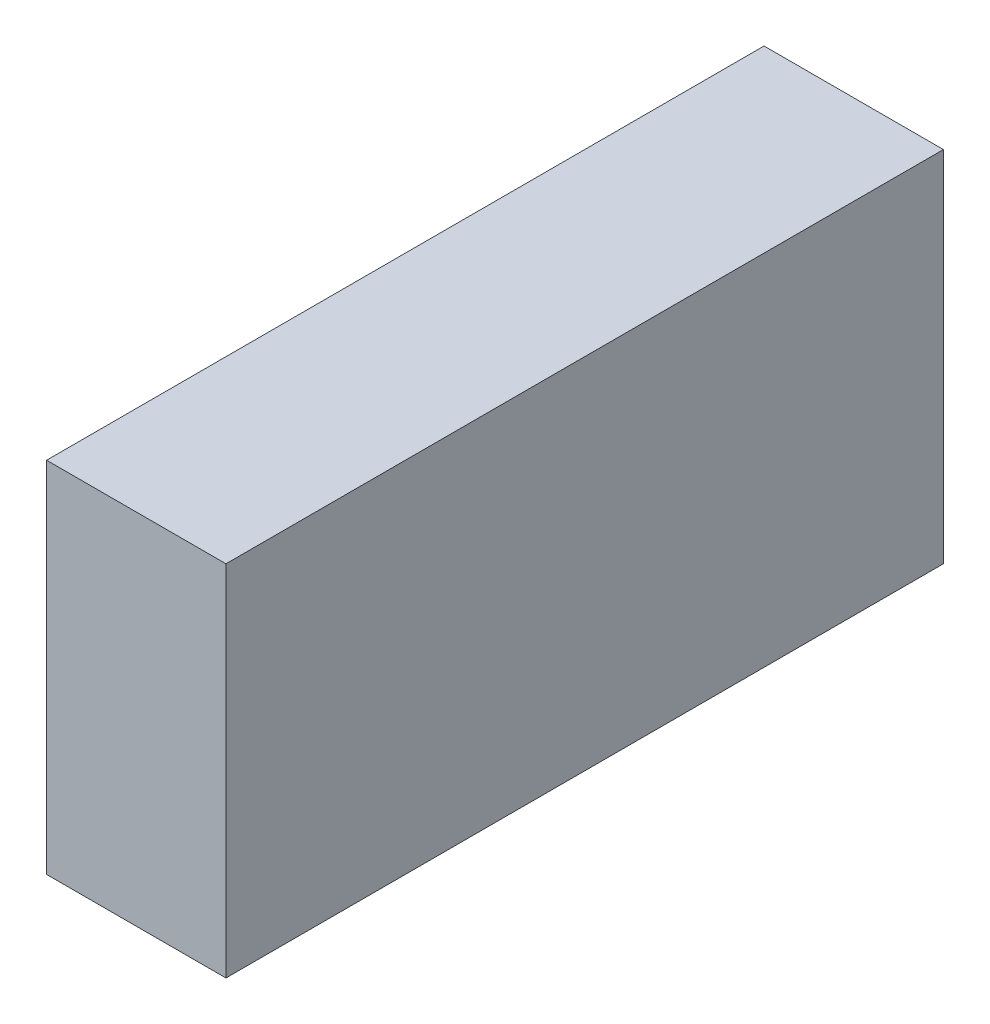
ISO-10303-21;
HEADER;
FILE_DESCRIPTION(('STEP AP214'),'2;1');
FILE_NAME('part.step','',(''),(''),'','','');
FILE_SCHEMA(('AUTOMOTIVE_DESIGN { 1 0 10303 214 1 1 1 1 }'));
ENDSEC;
DATA;
#1=APPLICATION_CONTEXT('core data for automotive mechanical design processes');
#2=APPLICATION_PROTOCOL_DEFINITION('international standard','automotive_design',2000,#1);
#3=PRODUCT_CONTEXT('',#1,'mechanical');
#4=PRODUCT('Part','Part','',(#3));
#5=PRODUCT_RELATED_PRODUCT_CATEGORY('part','',(#4));
#6=PRODUCT_DEFINITION_FORMATION('','',#4);
#7=PRODUCT_DEFINITION_CONTEXT('part definition',#1,'design');
#8=PRODUCT_DEFINITION('design','',#6,#7);
#9=PRODUCT_DEFINITION_SHAPE('','',#8);
#10=(LENGTH_UNIT() NAMED_UNIT(*) SI_UNIT(.MILLI.,.METRE.));
#11=(NAMED_UNIT(*) PLANE_ANGLE_UNIT() SI_UNIT($,.RADIAN.));
#12=(NAMED_UNIT(*) SI_UNIT($,.STERADIAN.) SOLID_ANGLE_UNIT());
#13=UNCERTAINTY_MEASURE_WITH_UNIT(LENGTH_MEASURE(1.E-05),#10,'distance_accuracy_value','');
#14=(GEOMETRIC_REPRESENTATION_CONTEXT(3) GLOBAL_UNCERTAINTY_ASSIGNED_CONTEXT((#13)) GLOBAL_UNIT_ASSIGNED_CONTEXT((#10,
#11,#12)) REPRESENTATION_CONTEXT('',''));
#15=CARTESIAN_POINT('',(0.,0.,0.));
#16=DIRECTION('',(0.,0.,1.));
#17=DIRECTION('',(1.,0.,0.));
#18=AXIS2_PLACEMENT_3D('',#15,#16,#17);
#19=CARTESIAN_POINT('',(0.,0.,40.));
#20=DIRECTION('',(1.,0.,0.));
#21=DIRECTION('',(0.,0.,-1.));
#22=AXIS2_PLACEMENT_3D('',#19,#20,#21);
#23=PLANE('',#22);
#24=DIRECTION('',(0.,-1.,0.));
#25=VECTOR('',#24,1.);
#26=CARTESIAN_POINT('',(0.,0.,0.));
#27=LINE('',#26,#25);
#28=CARTESIAN_POINT('',(0.,20.,0.));
#29=VERTEX_POINT('',#28);
#30=CARTESIAN_POINT('',(0.,0.,0.));
#31=VERTEX_POINT('',#30);
#32=EDGE_CURVE('E75',#29,#31,#27,.T.);
#33=ORIENTED_EDGE('',*,*,#32,.T.);
#34=DIRECTION('',(0.,0.,-1.));
#35=VECTOR('',#34,1.);
#36=CARTESIAN_POINT('',(0.,0.,40.));
#37=LINE('',#36,#35);
#38=CARTESIAN_POINT('',(0.,0.,40.));
#39=VERTEX_POINT('',#38);
#40=EDGE_CURVE('E11',#39,#31,#37,.T.);
#41=ORIENTED_EDGE('',*,*,#40,.F.);
#42=DIRECTION('',(0.,-1.,0.));
#43=VECTOR('',#42,1.);
#44=CARTESIAN_POINT('',(0.,0.,40.));
#45=LINE('',#44,#43);
#46=CARTESIAN_POINT('',(0.,20.,40.));
#47=VERTEX_POINT('',#46);
#48=EDGE_CURVE('E93',#47,#39,#45,.T.);
#49=ORIENTED_EDGE('',*,*,#48,.F.);
#50=DIRECTION('',(0.,0.,-1.));
#51=VECTOR('',#50,1.);
#52=CARTESIAN_POINT('',(0.,20.,40.));
#53=LINE('',#52,#51);
#54=EDGE_CURVE('E87',#47,#29,#53,.T.);
#55=ORIENTED_EDGE('',*,*,#54,.T.);
#56=EDGE_LOOP('',(#33,#41,#49,#55));
#57=FACE_BOUND('',#56,.T.);
#58=ADVANCED_FACE('F31',(#57),#23,.F.);
#59=CARTESIAN_POINT('',(0.,0.,40.));
#60=DIRECTION('',(0.,1.,0.));
#61=DIRECTION('',(0.,0.,1.));
#62=AXIS2_PLACEMENT_3D('',#59,#60,#61);
#63=PLANE('',#62);
#64=DIRECTION('',(1.,0.,0.));
#65=VECTOR('',#64,1.);
#66=CARTESIAN_POINT('',(0.,0.,0.));
#67=LINE('',#66,#65);
#68=CARTESIAN_POINT('',(10.,0.,0.));
#69=VERTEX_POINT('',#68);
#70=EDGE_CURVE('E71',#31,#69,#67,.T.);
#71=ORIENTED_EDGE('',*,*,#70,.T.);
#72=DIRECTION('',(0.,0.,-1.));
#73=VECTOR('',#72,1.);
#74=CARTESIAN_POINT('',(10.,0.,40.));
#75=LINE('',#74,#73);
#76=CARTESIAN_POINT('',(10.,0.,40.));
#77=VERTEX_POINT('',#76);
#78=EDGE_CURVE('E38',#77,#69,#75,.T.);
#79=ORIENTED_EDGE('',*,*,#78,.F.);
#80=DIRECTION('',(1.,0.,0.));
#81=VECTOR('',#80,1.);
#82=CARTESIAN_POINT('',(0.,0.,40.));
#83=LINE('',#82,#81);
#84=EDGE_CURVE('E83',#39,#77,#83,.T.);
#85=ORIENTED_EDGE('',*,*,#84,.F.);
#86=ORIENTED_EDGE('',*,*,#40,.T.);
#87=EDGE_LOOP('',(#71,#79,#85,#86));
#88=FACE_BOUND('',#87,.T.);
#89=ADVANCED_FACE('F82',(#88),#63,.F.);
#90=CARTESIAN_POINT('',(10.,0.,40.));
#91=DIRECTION('',(-1.,0.,0.));
#92=DIRECTION('',(0.,0.,1.));
#93=AXIS2_PLACEMENT_3D('',#90,#91,#92);
#94=PLANE('',#93);
#95=DIRECTION('',(0.,1.,0.));
#96=VECTOR('',#95,1.);
#97=CARTESIAN_POINT('',(10.,0.,0.));
#98=LINE('',#97,#96);
#99=CARTESIAN_POINT('',(10.,20.,0.));
#100=VERTEX_POINT('',#99);
#101=EDGE_CURVE('E76',#69,#100,#98,.T.);
#102=ORIENTED_EDGE('',*,*,#101,.T.);
#103=DIRECTION('',(0.,0.,-1.));
#104=VECTOR('',#103,1.);
#105=CARTESIAN_POINT('',(10.,20.,40.));
#106=LINE('',#105,#104);
#107=CARTESIAN_POINT('',(10.,20.,40.));
#108=VERTEX_POINT('',#107);
#109=EDGE_CURVE('E99',#108,#100,#106,.T.);
#110=ORIENTED_EDGE('',*,*,#109,.F.);
#111=DIRECTION('',(0.,1.,0.));
#112=VECTOR('',#111,1.);
#113=CARTESIAN_POINT('',(10.,0.,40.));
#114=LINE('',#113,#112);
#115=EDGE_CURVE('E50',#77,#108,#114,.T.);
#116=ORIENTED_EDGE('',*,*,#115,.F.);
#117=ORIENTED_EDGE('',*,*,#78,.T.);
#118=EDGE_LOOP('',(#102,#110,#116,#117));
#119=FACE_BOUND('',#118,.T.);
#120=ADVANCED_FACE('F102',(#119),#94,.F.);
#121=CARTESIAN_POINT('',(0.,20.,40.));
#122=DIRECTION('',(0.,-1.,0.));
#123=DIRECTION('',(0.,0.,-1.));
#124=AXIS2_PLACEMENT_3D('',#121,#122,#123);
#125=PLANE('',#124);
#126=DIRECTION('',(-1.,0.,0.));
#127=VECTOR('',#126,1.);
#128=CARTESIAN_POINT('',(0.,20.,0.));
#129=LINE('',#128,#127);
#130=EDGE_CURVE('E91',#100,#29,#129,.T.);
#131=ORIENTED_EDGE('',*,*,#130,.T.);
#132=ORIENTED_EDGE('',*,*,#54,.F.);
#133=DIRECTION('',(-1.,0.,0.));
#134=VECTOR('',#133,1.);
#135=CARTESIAN_POINT('',(0.,20.,40.));
#136=LINE('',#135,#134);
#137=EDGE_CURVE('E45',#108,#47,#136,.T.);
#138=ORIENTED_EDGE('',*,*,#137,.F.);
#139=ORIENTED_EDGE('',*,*,#109,.T.);
#140=EDGE_LOOP('',(#131,#132,#138,#139));
#141=FACE_BOUND('',#140,.T.);
#142=ADVANCED_FACE('F104',(#141),#125,.F.);
#143=CARTESIAN_POINT('',(0.,20.,40.));
#144=DIRECTION('',(0.,0.,-1.));
#145=DIRECTION('',(-1.,0.,0.));
#146=AXIS2_PLACEMENT_3D('',#143,#144,#145);
#147=PLANE('',#146);
#148=ORIENTED_EDGE('',*,*,#48,.T.);
#149=ORIENTED_EDGE('',*,*,#84,.T.);
#150=ORIENTED_EDGE('',*,*,#115,.T.);
#151=ORIENTED_EDGE('',*,*,#137,.T.);
#152=EDGE_LOOP('',(#148,#149,#150,#151));
#153=FACE_BOUND('',#152,.T.);
#154=ADVANCED_FACE('F105',(#153),#147,.F.);
#155=CARTESIAN_POINT('',(0.,20.,0.));
#156=DIRECTION('',(0.,0.,-1.));
#157=DIRECTION('',(-1.,0.,0.));
#158=AXIS2_PLACEMENT_3D('',#155,#156,#157);
#159=PLANE('',#158);
#160=ORIENTED_EDGE('',*,*,#32,.F.);
#161=ORIENTED_EDGE('',*,*,#130,.F.);
#162=ORIENTED_EDGE('',*,*,#101,.F.);
#163=ORIENTED_EDGE('',*,*,#70,.F.);
#164=EDGE_LOOP('',(#160,#161,#162,#163));
#165=FACE_BOUND('',#164,.T.);
#166=ADVANCED_FACE('F72',(#165),#159,.T.);
#167=CLOSED_SHELL('',(#58,#89,#120,#142,#154,#166));
#168=MANIFOLD_SOLID_BREP('B2',#167);
#169=ADVANCED_BREP_SHAPE_REPRESENTATION('',(#18,#168),#14);
#170=SHAPE_DEFINITION_REPRESENTATION(#9,#169);
ENDSEC;
END-ISO-10303-21;
